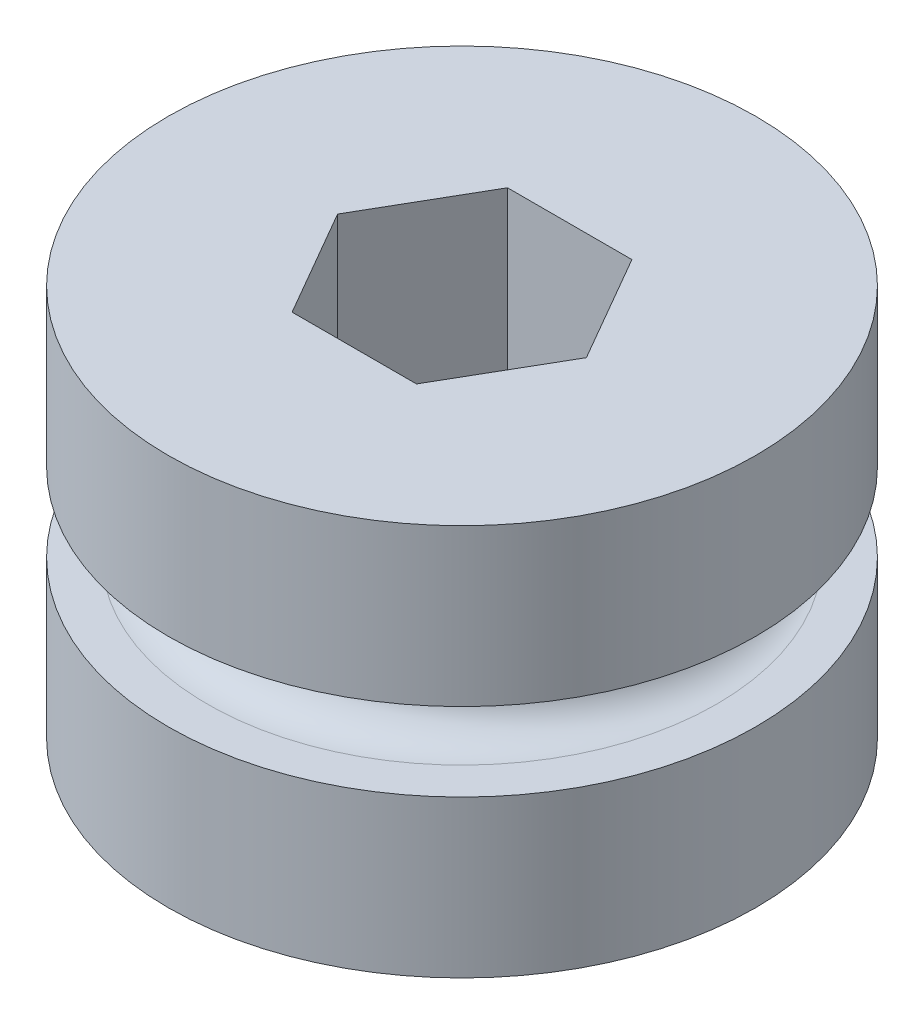
ISO-10303-21;
HEADER;
FILE_DESCRIPTION(('STEP AP214'),'2;1');
FILE_NAME('part.step','',(''),(''),'','','');
FILE_SCHEMA(('AUTOMOTIVE_DESIGN { 1 0 10303 214 1 1 1 1 }'));
ENDSEC;
DATA;
#1=APPLICATION_CONTEXT('core data for automotive mechanical design processes');
#2=APPLICATION_PROTOCOL_DEFINITION('international standard','automotive_design',2000,#1);
#3=PRODUCT_CONTEXT('',#1,'mechanical');
#4=PRODUCT('Part','Part','',(#3));
#5=PRODUCT_RELATED_PRODUCT_CATEGORY('part','',(#4));
#6=PRODUCT_DEFINITION_FORMATION('','',#4);
#7=PRODUCT_DEFINITION_CONTEXT('part definition',#1,'design');
#8=PRODUCT_DEFINITION('design','',#6,#7);
#9=PRODUCT_DEFINITION_SHAPE('','',#8);
#10=(LENGTH_UNIT() NAMED_UNIT(*) SI_UNIT(.MILLI.,.METRE.));
#11=(NAMED_UNIT(*) PLANE_ANGLE_UNIT() SI_UNIT($,.RADIAN.));
#12=(NAMED_UNIT(*) SI_UNIT($,.STERADIAN.) SOLID_ANGLE_UNIT());
#13=UNCERTAINTY_MEASURE_WITH_UNIT(LENGTH_MEASURE(1.E-05),#10,'distance_accuracy_value','');
#14=(GEOMETRIC_REPRESENTATION_CONTEXT(3) GLOBAL_UNCERTAINTY_ASSIGNED_CONTEXT((#13)) GLOBAL_UNIT_ASSIGNED_CONTEXT((#10,
#11,#12)) REPRESENTATION_CONTEXT('',''));
#15=CARTESIAN_POINT('',(0.,0.,0.));
#16=DIRECTION('',(0.,0.,1.));
#17=DIRECTION('',(1.,0.,0.));
#18=AXIS2_PLACEMENT_3D('',#15,#16,#17);
#19=CARTESIAN_POINT('',(0.,25.4,0.));
#20=DIRECTION('',(0.,-1.,0.));
#21=DIRECTION('',(0.,0.,-1.));
#22=AXIS2_PLACEMENT_3D('',#19,#20,#21);
#23=CYLINDRICAL_SURFACE('',#22,19.05);
#24=CARTESIAN_POINT('',(0.,0.,0.));
#25=DIRECTION('',(0.,1.,0.));
#26=DIRECTION('',(0.,0.,1.));
#27=AXIS2_PLACEMENT_3D('',#24,#25,#26);
#28=CIRCLE('',#27,19.05);
#29=CARTESIAN_POINT('',(0.,0.,19.05));
#30=VERTEX_POINT('',#29);
#31=EDGE_CURVE('E36',#30,#30,#28,.T.);
#32=ORIENTED_EDGE('',*,*,#31,.T.);
#33=EDGE_LOOP('',(#32));
#34=FACE_BOUND('',#33,.T.);
#35=CARTESIAN_POINT('',(0.,10.16,0.));
#36=DIRECTION('',(0.,-1.,0.));
#37=DIRECTION('',(1.,0.,0.));
#38=AXIS2_PLACEMENT_3D('',#35,#36,#37);
#39=CIRCLE('',#38,19.05);
#40=CARTESIAN_POINT('',(19.05,10.16,0.));
#41=VERTEX_POINT('',#40);
#42=EDGE_CURVE('E143',#41,#41,#39,.T.);
#43=ORIENTED_EDGE('',*,*,#42,.T.);
#44=EDGE_LOOP('',(#43));
#45=FACE_BOUND('',#44,.T.);
#46=ADVANCED_FACE('F33',(#34,#45),#23,.T.);
#47=CARTESIAN_POINT('',(0.,0.,0.));
#48=DIRECTION('',(0.,1.,0.));
#49=DIRECTION('',(0.,0.,1.));
#50=AXIS2_PLACEMENT_3D('',#47,#48,#49);
#51=PLANE('',#50);
#52=DIRECTION('',(1.,0.,0.));
#53=VECTOR('',#52,1.);
#54=CARTESIAN_POINT('',(-4.03279163028954,0.,6.985));
#55=LINE('',#54,#53);
#56=CARTESIAN_POINT('',(-4.03279163028954,0.,6.985));
#57=VERTEX_POINT('',#56);
#58=CARTESIAN_POINT('',(4.03279163028954,0.,6.985));
#59=VERTEX_POINT('',#58);
#60=EDGE_CURVE('E93',#57,#59,#55,.T.);
#61=ORIENTED_EDGE('',*,*,#60,.T.);
#62=DIRECTION('',(0.5,0.,-0.866025403784439));
#63=VECTOR('',#62,1.);
#64=CARTESIAN_POINT('',(4.03279163028954,0.,6.985));
#65=LINE('',#64,#63);
#66=CARTESIAN_POINT('',(8.06558326057907,0.,0.));
#67=VERTEX_POINT('',#66);
#68=EDGE_CURVE('E87',#59,#67,#65,.T.);
#69=ORIENTED_EDGE('',*,*,#68,.T.);
#70=DIRECTION('',(-0.5,0.,-0.866025403784439));
#71=VECTOR('',#70,1.);
#72=CARTESIAN_POINT('',(8.06558326057907,0.,0.));
#73=LINE('',#72,#71);
#74=CARTESIAN_POINT('',(4.03279163028953,0.,-6.985));
#75=VERTEX_POINT('',#74);
#76=EDGE_CURVE('E96',#67,#75,#73,.T.);
#77=ORIENTED_EDGE('',*,*,#76,.T.);
#78=DIRECTION('',(-1.,0.,0.));
#79=VECTOR('',#78,1.);
#80=CARTESIAN_POINT('',(4.03279163028953,0.,-6.98500000000001));
#81=LINE('',#80,#79);
#82=CARTESIAN_POINT('',(-4.03279163028954,0.,-6.98500000000001));
#83=VERTEX_POINT('',#82);
#84=EDGE_CURVE('E47',#75,#83,#81,.T.);
#85=ORIENTED_EDGE('',*,*,#84,.T.);
#86=DIRECTION('',(-0.5,0.,0.866025403784439));
#87=VECTOR('',#86,1.);
#88=CARTESIAN_POINT('',(-4.03279163028954,0.,-6.98500000000001));
#89=LINE('',#88,#87);
#90=CARTESIAN_POINT('',(-8.06558326057908,0.,0.));
#91=VERTEX_POINT('',#90);
#92=EDGE_CURVE('E111',#83,#91,#89,.T.);
#93=ORIENTED_EDGE('',*,*,#92,.T.);
#94=DIRECTION('',(0.5,0.,0.866025403784439));
#95=VECTOR('',#94,1.);
#96=CARTESIAN_POINT('',(-8.06558326057908,0.,0.));
#97=LINE('',#96,#95);
#98=EDGE_CURVE('E114',#91,#57,#97,.T.);
#99=ORIENTED_EDGE('',*,*,#98,.T.);
#100=EDGE_LOOP('',(#61,#69,#77,#85,#93,#99));
#101=FACE_BOUND('',#100,.T.);
#102=ORIENTED_EDGE('',*,*,#31,.F.);
#103=EDGE_LOOP('',(#102));
#104=FACE_BOUND('',#103,.T.);
#105=ADVANCED_FACE('F100',(#101,#104),#51,.F.);
#106=CARTESIAN_POINT('',(0.,12.7,0.));
#107=DIRECTION('',(0.,-1.,0.));
#108=DIRECTION('',(1.,0.,0.));
#109=AXIS2_PLACEMENT_3D('',#106,#107,#108);
#110=TOROIDAL_SURFACE('',#109,16.51,2.54);
#111=CARTESIAN_POINT('',(0.,10.16,0.));
#112=DIRECTION('',(0.,-1.,0.));
#113=DIRECTION('',(1.,0.,0.));
#114=AXIS2_PLACEMENT_3D('',#111,#112,#113);
#115=CIRCLE('',#114,16.51);
#116=CARTESIAN_POINT('',(16.51,10.16,0.));
#117=VERTEX_POINT('',#116);
#118=EDGE_CURVE('E146',#117,#117,#115,.T.);
#119=ORIENTED_EDGE('',*,*,#118,.F.);
#120=EDGE_LOOP('',(#119));
#121=FACE_BOUND('',#120,.T.);
#122=CARTESIAN_POINT('',(0.,15.24,0.));
#123=DIRECTION('',(0.,-1.,0.));
#124=DIRECTION('',(1.,0.,0.));
#125=AXIS2_PLACEMENT_3D('',#122,#123,#124);
#126=CIRCLE('',#125,16.51);
#127=CARTESIAN_POINT('',(16.51,15.24,0.));
#128=VERTEX_POINT('',#127);
#129=EDGE_CURVE('E130',#128,#128,#126,.T.);
#130=ORIENTED_EDGE('',*,*,#129,.T.);
#131=EDGE_LOOP('',(#130));
#132=FACE_BOUND('',#131,.T.);
#133=ADVANCED_FACE('F155',(#121,#132),#110,.F.);
#134=CARTESIAN_POINT('',(-19.05,10.16,0.));
#135=DIRECTION('',(0.,1.,0.));
#136=DIRECTION('',(-1.,0.,0.));
#137=AXIS2_PLACEMENT_3D('',#134,#135,#136);
#138=PLANE('',#137);
#139=ORIENTED_EDGE('',*,*,#118,.T.);
#140=EDGE_LOOP('',(#139));
#141=FACE_BOUND('',#140,.T.);
#142=ORIENTED_EDGE('',*,*,#42,.F.);
#143=EDGE_LOOP('',(#142));
#144=FACE_BOUND('',#143,.T.);
#145=ADVANCED_FACE('F160',(#141,#144),#138,.T.);
#146=CARTESIAN_POINT('',(-16.51,15.24,0.));
#147=DIRECTION('',(0.,-1.,0.));
#148=DIRECTION('',(1.,0.,0.));
#149=AXIS2_PLACEMENT_3D('',#146,#147,#148);
#150=PLANE('',#149);
#151=CARTESIAN_POINT('',(0.,15.24,0.));
#152=DIRECTION('',(0.,-1.,0.));
#153=DIRECTION('',(1.,0.,0.));
#154=AXIS2_PLACEMENT_3D('',#151,#152,#153);
#155=CIRCLE('',#154,19.05);
#156=CARTESIAN_POINT('',(19.05,15.24,0.));
#157=VERTEX_POINT('',#156);
#158=EDGE_CURVE('E140',#157,#157,#155,.T.);
#159=ORIENTED_EDGE('',*,*,#158,.T.);
#160=EDGE_LOOP('',(#159));
#161=FACE_BOUND('',#160,.T.);
#162=ORIENTED_EDGE('',*,*,#129,.F.);
#163=EDGE_LOOP('',(#162));
#164=FACE_BOUND('',#163,.T.);
#165=ADVANCED_FACE('F167',(#161,#164),#150,.T.);
#166=CARTESIAN_POINT('',(0.,25.4,0.));
#167=DIRECTION('',(0.,1.,0.));
#168=DIRECTION('',(0.,0.,1.));
#169=AXIS2_PLACEMENT_3D('',#166,#167,#168);
#170=PLANE('',#169);
#171=DIRECTION('',(0.5,0.,-0.866025403784439));
#172=VECTOR('',#171,1.);
#173=CARTESIAN_POINT('',(4.03279163028954,25.4,6.985));
#174=LINE('',#173,#172);
#175=CARTESIAN_POINT('',(4.03279163028954,25.4,6.985));
#176=VERTEX_POINT('',#175);
#177=CARTESIAN_POINT('',(8.06558326057907,25.4,0.));
#178=VERTEX_POINT('',#177);
#179=EDGE_CURVE('E55',#176,#178,#174,.T.);
#180=ORIENTED_EDGE('',*,*,#179,.F.);
#181=DIRECTION('',(1.,0.,0.));
#182=VECTOR('',#181,1.);
#183=CARTESIAN_POINT('',(-4.03279163028954,25.4,6.985));
#184=LINE('',#183,#182);
#185=CARTESIAN_POINT('',(-4.03279163028954,25.4,6.985));
#186=VERTEX_POINT('',#185);
#187=EDGE_CURVE('E104',#186,#176,#184,.T.);
#188=ORIENTED_EDGE('',*,*,#187,.F.);
#189=DIRECTION('',(0.5,0.,0.866025403784439));
#190=VECTOR('',#189,1.);
#191=CARTESIAN_POINT('',(-8.06558326057908,25.4,0.));
#192=LINE('',#191,#190);
#193=CARTESIAN_POINT('',(-8.06558326057908,25.4,0.));
#194=VERTEX_POINT('',#193);
#195=EDGE_CURVE('E107',#194,#186,#192,.T.);
#196=ORIENTED_EDGE('',*,*,#195,.F.);
#197=DIRECTION('',(-0.5,0.,0.866025403784439));
#198=VECTOR('',#197,1.);
#199=CARTESIAN_POINT('',(-4.03279163028954,25.4,-6.98500000000001));
#200=LINE('',#199,#198);
#201=CARTESIAN_POINT('',(-4.03279163028954,25.4,-6.98500000000001));
#202=VERTEX_POINT('',#201);
#203=EDGE_CURVE('E123',#202,#194,#200,.T.);
#204=ORIENTED_EDGE('',*,*,#203,.F.);
#205=DIRECTION('',(-1.,0.,0.));
#206=VECTOR('',#205,1.);
#207=CARTESIAN_POINT('',(4.03279163028953,25.4,-6.98500000000001));
#208=LINE('',#207,#206);
#209=CARTESIAN_POINT('',(4.03279163028953,25.4,-6.98500000000001));
#210=VERTEX_POINT('',#209);
#211=EDGE_CURVE('E120',#210,#202,#208,.T.);
#212=ORIENTED_EDGE('',*,*,#211,.F.);
#213=DIRECTION('',(-0.5,0.,-0.866025403784439));
#214=VECTOR('',#213,1.);
#215=CARTESIAN_POINT('',(8.06558326057907,25.4,0.));
#216=LINE('',#215,#214);
#217=EDGE_CURVE('E118',#178,#210,#216,.T.);
#218=ORIENTED_EDGE('',*,*,#217,.F.);
#219=EDGE_LOOP('',(#180,#188,#196,#204,#212,#218));
#220=FACE_BOUND('',#219,.T.);
#221=CARTESIAN_POINT('',(0.,25.4,0.));
#222=DIRECTION('',(0.,1.,0.));
#223=DIRECTION('',(0.,0.,1.));
#224=AXIS2_PLACEMENT_3D('',#221,#222,#223);
#225=CIRCLE('',#224,19.05);
#226=CARTESIAN_POINT('',(0.,25.4,19.05));
#227=VERTEX_POINT('',#226);
#228=EDGE_CURVE('E11',#227,#227,#225,.T.);
#229=ORIENTED_EDGE('',*,*,#228,.T.);
#230=EDGE_LOOP('',(#229));
#231=FACE_BOUND('',#230,.T.);
#232=ADVANCED_FACE('F165',(#220,#231),#170,.T.);
#233=ORIENTED_EDGE('',*,*,#228,.F.);
#234=EDGE_LOOP('',(#233));
#235=FACE_BOUND('',#234,.T.);
#236=ORIENTED_EDGE('',*,*,#158,.F.);
#237=EDGE_LOOP('',(#236));
#238=FACE_BOUND('',#237,.T.);
#239=ADVANCED_FACE('F163',(#235,#238),#23,.T.);
#240=CARTESIAN_POINT('',(4.03279163028954,0.,6.985));
#241=DIRECTION('',(0.866025403784439,0.,0.5));
#242=DIRECTION('',(0.5,0.,-0.866025403784439));
#243=AXIS2_PLACEMENT_3D('',#240,#241,#242);
#244=PLANE('',#243);
#245=ORIENTED_EDGE('',*,*,#179,.T.);
#246=DIRECTION('',(0.,1.,0.));
#247=VECTOR('',#246,1.);
#248=CARTESIAN_POINT('',(8.06558326057907,0.,0.));
#249=LINE('',#248,#247);
#250=EDGE_CURVE('E83',#67,#178,#249,.T.);
#251=ORIENTED_EDGE('',*,*,#250,.F.);
#252=ORIENTED_EDGE('',*,*,#68,.F.);
#253=DIRECTION('',(0.,1.,0.));
#254=VECTOR('',#253,1.);
#255=CARTESIAN_POINT('',(4.03279163028954,0.,6.985));
#256=LINE('',#255,#254);
#257=EDGE_CURVE('E128',#59,#176,#256,.T.);
#258=ORIENTED_EDGE('',*,*,#257,.T.);
#259=EDGE_LOOP('',(#245,#251,#252,#258));
#260=FACE_BOUND('',#259,.T.);
#261=ADVANCED_FACE('F85',(#260),#244,.F.);
#262=CARTESIAN_POINT('',(-4.03279163028954,0.,6.985));
#263=DIRECTION('',(0.,0.,1.));
#264=DIRECTION('',(1.,0.,0.));
#265=AXIS2_PLACEMENT_3D('',#262,#263,#264);
#266=PLANE('',#265);
#267=ORIENTED_EDGE('',*,*,#187,.T.);
#268=ORIENTED_EDGE('',*,*,#257,.F.);
#269=ORIENTED_EDGE('',*,*,#60,.F.);
#270=DIRECTION('',(0.,1.,0.));
#271=VECTOR('',#270,1.);
#272=CARTESIAN_POINT('',(-4.03279163028954,0.,6.985));
#273=LINE('',#272,#271);
#274=EDGE_CURVE('E131',#57,#186,#273,.T.);
#275=ORIENTED_EDGE('',*,*,#274,.T.);
#276=EDGE_LOOP('',(#267,#268,#269,#275));
#277=FACE_BOUND('',#276,.T.);
#278=ADVANCED_FACE('F177',(#277),#266,.F.);
#279=CARTESIAN_POINT('',(-8.06558326057908,0.,0.));
#280=DIRECTION('',(-0.866025403784439,0.,0.5));
#281=DIRECTION('',(0.5,0.,0.866025403784439));
#282=AXIS2_PLACEMENT_3D('',#279,#280,#281);
#283=PLANE('',#282);
#284=ORIENTED_EDGE('',*,*,#195,.T.);
#285=ORIENTED_EDGE('',*,*,#274,.F.);
#286=ORIENTED_EDGE('',*,*,#98,.F.);
#287=DIRECTION('',(0.,1.,0.));
#288=VECTOR('',#287,1.);
#289=CARTESIAN_POINT('',(-8.06558326057908,0.,0.));
#290=LINE('',#289,#288);
#291=EDGE_CURVE('E133',#91,#194,#290,.T.);
#292=ORIENTED_EDGE('',*,*,#291,.T.);
#293=EDGE_LOOP('',(#284,#285,#286,#292));
#294=FACE_BOUND('',#293,.T.);
#295=ADVANCED_FACE('F186',(#294),#283,.F.);
#296=CARTESIAN_POINT('',(-4.03279163028954,0.,-6.98500000000001));
#297=DIRECTION('',(-0.866025403784439,0.,-0.5));
#298=DIRECTION('',(-0.5,0.,0.866025403784439));
#299=AXIS2_PLACEMENT_3D('',#296,#297,#298);
#300=PLANE('',#299);
#301=ORIENTED_EDGE('',*,*,#203,.T.);
#302=ORIENTED_EDGE('',*,*,#291,.F.);
#303=ORIENTED_EDGE('',*,*,#92,.F.);
#304=DIRECTION('',(0.,1.,0.));
#305=VECTOR('',#304,1.);
#306=CARTESIAN_POINT('',(-4.03279163028954,0.,-6.98500000000001));
#307=LINE('',#306,#305);
#308=EDGE_CURVE('E135',#83,#202,#307,.T.);
#309=ORIENTED_EDGE('',*,*,#308,.T.);
#310=EDGE_LOOP('',(#301,#302,#303,#309));
#311=FACE_BOUND('',#310,.T.);
#312=ADVANCED_FACE('F183',(#311),#300,.F.);
#313=CARTESIAN_POINT('',(4.03279163028953,0.,-6.98500000000001));
#314=DIRECTION('',(0.,0.,-1.));
#315=DIRECTION('',(-1.,0.,0.));
#316=AXIS2_PLACEMENT_3D('',#313,#314,#315);
#317=PLANE('',#316);
#318=ORIENTED_EDGE('',*,*,#211,.T.);
#319=ORIENTED_EDGE('',*,*,#308,.F.);
#320=ORIENTED_EDGE('',*,*,#84,.F.);
#321=DIRECTION('',(0.,1.,0.));
#322=VECTOR('',#321,1.);
#323=CARTESIAN_POINT('',(4.03279163028953,0.,-6.98500000000001));
#324=LINE('',#323,#322);
#325=EDGE_CURVE('E92',#75,#210,#324,.T.);
#326=ORIENTED_EDGE('',*,*,#325,.T.);
#327=EDGE_LOOP('',(#318,#319,#320,#326));
#328=FACE_BOUND('',#327,.T.);
#329=ADVANCED_FACE('F180',(#328),#317,.F.);
#330=CARTESIAN_POINT('',(8.06558326057907,0.,0.));
#331=DIRECTION('',(0.866025403784439,0.,-0.5));
#332=DIRECTION('',(-0.5,0.,-0.866025403784439));
#333=AXIS2_PLACEMENT_3D('',#330,#331,#332);
#334=PLANE('',#333);
#335=ORIENTED_EDGE('',*,*,#217,.T.);
#336=ORIENTED_EDGE('',*,*,#325,.F.);
#337=ORIENTED_EDGE('',*,*,#76,.F.);
#338=ORIENTED_EDGE('',*,*,#250,.T.);
#339=EDGE_LOOP('',(#335,#336,#337,#338));
#340=FACE_BOUND('',#339,.T.);
#341=ADVANCED_FACE('F97',(#340),#334,.F.);
#342=CLOSED_SHELL('',(#46,#105,#133,#145,#165,#232,#239,#261,#278,#295,#312,#329,#341));
#343=MANIFOLD_SOLID_BREP('B2',#342);
#344=ADVANCED_BREP_SHAPE_REPRESENTATION('',(#18,#343),#14);
#345=SHAPE_DEFINITION_REPRESENTATION(#9,#344);
ENDSEC;
END-ISO-10303-21;
